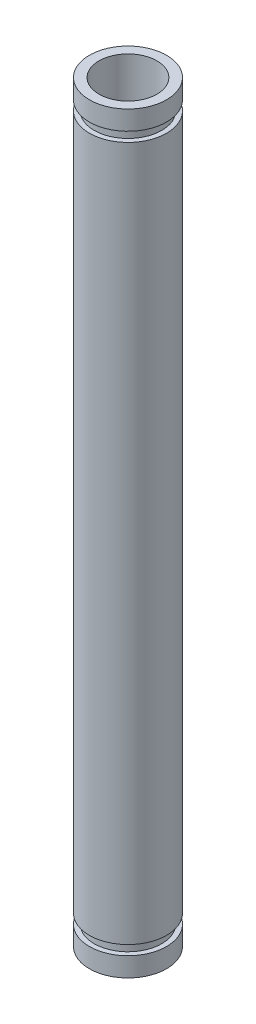
ISO-10303-21;
HEADER;
FILE_DESCRIPTION(('STEP AP214'),'2;1');
FILE_NAME('part.step','',(''),(''),'','','');
FILE_SCHEMA(('AUTOMOTIVE_DESIGN { 1 0 10303 214 1 1 1 1 }'));
ENDSEC;
DATA;
#1=APPLICATION_CONTEXT('core data for automotive mechanical design processes');
#2=APPLICATION_PROTOCOL_DEFINITION('international standard','automotive_design',2000,#1);
#3=PRODUCT_CONTEXT('',#1,'mechanical');
#4=PRODUCT('Part','Part','',(#3));
#5=PRODUCT_RELATED_PRODUCT_CATEGORY('part','',(#4));
#6=PRODUCT_DEFINITION_FORMATION('','',#4);
#7=PRODUCT_DEFINITION_CONTEXT('part definition',#1,'design');
#8=PRODUCT_DEFINITION('design','',#6,#7);
#9=PRODUCT_DEFINITION_SHAPE('','',#8);
#10=(LENGTH_UNIT() NAMED_UNIT(*) SI_UNIT(.MILLI.,.METRE.));
#11=(NAMED_UNIT(*) PLANE_ANGLE_UNIT() SI_UNIT($,.RADIAN.));
#12=(NAMED_UNIT(*) SI_UNIT($,.STERADIAN.) SOLID_ANGLE_UNIT());
#13=UNCERTAINTY_MEASURE_WITH_UNIT(LENGTH_MEASURE(1.E-05),#10,'distance_accuracy_value','');
#14=(GEOMETRIC_REPRESENTATION_CONTEXT(3) GLOBAL_UNCERTAINTY_ASSIGNED_CONTEXT((#13)) GLOBAL_UNIT_ASSIGNED_CONTEXT((#10,
#11,#12)) REPRESENTATION_CONTEXT('',''));
#15=CARTESIAN_POINT('',(0.,0.,0.));
#16=DIRECTION('',(0.,0.,1.));
#17=DIRECTION('',(1.,0.,0.));
#18=AXIS2_PLACEMENT_3D('',#15,#16,#17);
#19=CARTESIAN_POINT('',(0.,43.9529442426575,0.));
#20=DIRECTION('',(0.,1.,0.));
#21=DIRECTION('',(0.,0.,1.));
#22=AXIS2_PLACEMENT_3D('',#19,#20,#21);
#23=CYLINDRICAL_SURFACE('',#22,3.);
#24=CARTESIAN_POINT('',(0.,39.,0.));
#25=DIRECTION('',(0.,1.,0.));
#26=DIRECTION('',(0.,0.,1.));
#27=AXIS2_PLACEMENT_3D('',#24,#25,#26);
#28=CIRCLE('',#27,3.);
#29=CARTESIAN_POINT('',(0.,39.,3.));
#30=VERTEX_POINT('',#29);
#31=EDGE_CURVE('E93',#30,#30,#28,.T.);
#32=ORIENTED_EDGE('',*,*,#31,.T.);
#33=EDGE_LOOP('',(#32));
#34=FACE_BOUND('',#33,.T.);
#35=CARTESIAN_POINT('',(0.,-39.,0.));
#36=DIRECTION('',(0.,1.,0.));
#37=DIRECTION('',(0.,0.,1.));
#38=AXIS2_PLACEMENT_3D('',#35,#36,#37);
#39=CIRCLE('',#38,3.);
#40=CARTESIAN_POINT('',(0.,-39.,3.));
#41=VERTEX_POINT('',#40);
#42=EDGE_CURVE('E10',#41,#41,#39,.T.);
#43=ORIENTED_EDGE('',*,*,#42,.F.);
#44=EDGE_LOOP('',(#43));
#45=FACE_BOUND('',#44,.T.);
#46=ADVANCED_FACE('F45',(#34,#45),#23,.F.);
#47=CARTESIAN_POINT('',(-3.,-39.,0.));
#48=DIRECTION('',(0.,-1.,0.));
#49=DIRECTION('',(0.,0.,-1.));
#50=AXIS2_PLACEMENT_3D('',#47,#48,#49);
#51=PLANE('',#50);
#52=ORIENTED_EDGE('',*,*,#42,.T.);
#53=EDGE_LOOP('',(#52));
#54=FACE_BOUND('',#53,.T.);
#55=CARTESIAN_POINT('',(0.,-39.,0.));
#56=DIRECTION('',(0.,1.,0.));
#57=DIRECTION('',(0.,0.,1.));
#58=AXIS2_PLACEMENT_3D('',#55,#56,#57);
#59=CIRCLE('',#58,4.);
#60=CARTESIAN_POINT('',(0.,-39.,4.));
#61=VERTEX_POINT('',#60);
#62=EDGE_CURVE('E47',#61,#61,#59,.T.);
#63=ORIENTED_EDGE('',*,*,#62,.F.);
#64=EDGE_LOOP('',(#63));
#65=FACE_BOUND('',#64,.T.);
#66=ADVANCED_FACE('F115',(#54,#65),#51,.T.);
#67=CARTESIAN_POINT('',(0.,43.9529442426575,0.));
#68=DIRECTION('',(0.,1.,0.));
#69=DIRECTION('',(0.,0.,1.));
#70=AXIS2_PLACEMENT_3D('',#67,#68,#69);
#71=CYLINDRICAL_SURFACE('',#70,4.);
#72=ORIENTED_EDGE('',*,*,#62,.T.);
#73=EDGE_LOOP('',(#72));
#74=FACE_BOUND('',#73,.T.);
#75=CARTESIAN_POINT('',(0.,-37.,0.));
#76=DIRECTION('',(0.,1.,0.));
#77=DIRECTION('',(0.,0.,1.));
#78=AXIS2_PLACEMENT_3D('',#75,#76,#77);
#79=CIRCLE('',#78,4.);
#80=CARTESIAN_POINT('',(0.,-37.,4.));
#81=VERTEX_POINT('',#80);
#82=EDGE_CURVE('E53',#81,#81,#79,.T.);
#83=ORIENTED_EDGE('',*,*,#82,.F.);
#84=EDGE_LOOP('',(#83));
#85=FACE_BOUND('',#84,.T.);
#86=ADVANCED_FACE('F117',(#74,#85),#71,.T.);
#87=CARTESIAN_POINT('',(-4.,-37.,0.));
#88=DIRECTION('',(0.,1.,0.));
#89=DIRECTION('',(0.,0.,1.));
#90=AXIS2_PLACEMENT_3D('',#87,#88,#89);
#91=PLANE('',#90);
#92=ORIENTED_EDGE('',*,*,#82,.T.);
#93=EDGE_LOOP('',(#92));
#94=FACE_BOUND('',#93,.T.);
#95=CARTESIAN_POINT('',(0.,-37.,0.));
#96=DIRECTION('',(0.,1.,0.));
#97=DIRECTION('',(0.,0.,1.));
#98=AXIS2_PLACEMENT_3D('',#95,#96,#97);
#99=CIRCLE('',#98,3.5);
#100=CARTESIAN_POINT('',(0.,-37.,3.5));
#101=VERTEX_POINT('',#100);
#102=EDGE_CURVE('E56',#101,#101,#99,.T.);
#103=ORIENTED_EDGE('',*,*,#102,.F.);
#104=EDGE_LOOP('',(#103));
#105=FACE_BOUND('',#104,.T.);
#106=ADVANCED_FACE('F118',(#94,#105),#91,.T.);
#107=CARTESIAN_POINT('',(0.,43.9529442426575,0.));
#108=DIRECTION('',(0.,1.,0.));
#109=DIRECTION('',(0.,0.,1.));
#110=AXIS2_PLACEMENT_3D('',#107,#108,#109);
#111=CYLINDRICAL_SURFACE('',#110,3.5);
#112=ORIENTED_EDGE('',*,*,#102,.T.);
#113=EDGE_LOOP('',(#112));
#114=FACE_BOUND('',#113,.T.);
#115=CARTESIAN_POINT('',(0.,-36.,0.));
#116=DIRECTION('',(0.,1.,0.));
#117=DIRECTION('',(0.,0.,1.));
#118=AXIS2_PLACEMENT_3D('',#115,#116,#117);
#119=CIRCLE('',#118,3.5);
#120=CARTESIAN_POINT('',(0.,-36.,3.5));
#121=VERTEX_POINT('',#120);
#122=EDGE_CURVE('E64',#121,#121,#119,.T.);
#123=ORIENTED_EDGE('',*,*,#122,.F.);
#124=EDGE_LOOP('',(#123));
#125=FACE_BOUND('',#124,.T.);
#126=ADVANCED_FACE('F128',(#114,#125),#111,.T.);
#127=CARTESIAN_POINT('',(-3.5,-36.,0.));
#128=DIRECTION('',(0.,-1.,0.));
#129=DIRECTION('',(0.,0.,-1.));
#130=AXIS2_PLACEMENT_3D('',#127,#128,#129);
#131=PLANE('',#130);
#132=ORIENTED_EDGE('',*,*,#122,.T.);
#133=EDGE_LOOP('',(#132));
#134=FACE_BOUND('',#133,.T.);
#135=CARTESIAN_POINT('',(0.,-36.,0.));
#136=DIRECTION('',(0.,1.,0.));
#137=DIRECTION('',(0.,0.,1.));
#138=AXIS2_PLACEMENT_3D('',#135,#136,#137);
#139=CIRCLE('',#138,4.);
#140=CARTESIAN_POINT('',(0.,-36.,4.));
#141=VERTEX_POINT('',#140);
#142=EDGE_CURVE('E69',#141,#141,#139,.T.);
#143=ORIENTED_EDGE('',*,*,#142,.F.);
#144=EDGE_LOOP('',(#143));
#145=FACE_BOUND('',#144,.T.);
#146=ADVANCED_FACE('F127',(#134,#145),#131,.T.);
#147=CARTESIAN_POINT('',(0.,43.9529442426575,0.));
#148=DIRECTION('',(0.,1.,0.));
#149=DIRECTION('',(0.,0.,1.));
#150=AXIS2_PLACEMENT_3D('',#147,#148,#149);
#151=CYLINDRICAL_SURFACE('',#150,4.);
#152=ORIENTED_EDGE('',*,*,#142,.T.);
#153=EDGE_LOOP('',(#152));
#154=FACE_BOUND('',#153,.T.);
#155=CARTESIAN_POINT('',(0.,36.,0.));
#156=DIRECTION('',(0.,1.,0.));
#157=DIRECTION('',(0.,0.,1.));
#158=AXIS2_PLACEMENT_3D('',#155,#156,#157);
#159=CIRCLE('',#158,4.);
#160=CARTESIAN_POINT('',(0.,36.,4.));
#161=VERTEX_POINT('',#160);
#162=EDGE_CURVE('E75',#161,#161,#159,.T.);
#163=ORIENTED_EDGE('',*,*,#162,.F.);
#164=EDGE_LOOP('',(#163));
#165=FACE_BOUND('',#164,.T.);
#166=ADVANCED_FACE('F132',(#154,#165),#151,.T.);
#167=CARTESIAN_POINT('',(-3.5,36.,0.));
#168=DIRECTION('',(0.,1.,0.));
#169=DIRECTION('',(0.,0.,1.));
#170=AXIS2_PLACEMENT_3D('',#167,#168,#169);
#171=PLANE('',#170);
#172=ORIENTED_EDGE('',*,*,#162,.T.);
#173=EDGE_LOOP('',(#172));
#174=FACE_BOUND('',#173,.T.);
#175=CARTESIAN_POINT('',(0.,36.,0.));
#176=DIRECTION('',(0.,1.,0.));
#177=DIRECTION('',(0.,0.,1.));
#178=AXIS2_PLACEMENT_3D('',#175,#176,#177);
#179=CIRCLE('',#178,3.5);
#180=CARTESIAN_POINT('',(0.,36.,3.5));
#181=VERTEX_POINT('',#180);
#182=EDGE_CURVE('E77',#181,#181,#179,.T.);
#183=ORIENTED_EDGE('',*,*,#182,.F.);
#184=EDGE_LOOP('',(#183));
#185=FACE_BOUND('',#184,.T.);
#186=ADVANCED_FACE('F138',(#174,#185),#171,.T.);
#187=CARTESIAN_POINT('',(0.,43.9529442426575,0.));
#188=DIRECTION('',(0.,1.,0.));
#189=DIRECTION('',(0.,0.,1.));
#190=AXIS2_PLACEMENT_3D('',#187,#188,#189);
#191=CYLINDRICAL_SURFACE('',#190,3.5);
#192=ORIENTED_EDGE('',*,*,#182,.T.);
#193=EDGE_LOOP('',(#192));
#194=FACE_BOUND('',#193,.T.);
#195=CARTESIAN_POINT('',(0.,37.,0.));
#196=DIRECTION('',(0.,1.,0.));
#197=DIRECTION('',(0.,0.,1.));
#198=AXIS2_PLACEMENT_3D('',#195,#196,#197);
#199=CIRCLE('',#198,3.5);
#200=CARTESIAN_POINT('',(0.,37.,3.5));
#201=VERTEX_POINT('',#200);
#202=EDGE_CURVE('E83',#201,#201,#199,.T.);
#203=ORIENTED_EDGE('',*,*,#202,.F.);
#204=EDGE_LOOP('',(#203));
#205=FACE_BOUND('',#204,.T.);
#206=ADVANCED_FACE('F145',(#194,#205),#191,.T.);
#207=CARTESIAN_POINT('',(-4.,37.,0.));
#208=DIRECTION('',(0.,-1.,0.));
#209=DIRECTION('',(0.,0.,-1.));
#210=AXIS2_PLACEMENT_3D('',#207,#208,#209);
#211=PLANE('',#210);
#212=ORIENTED_EDGE('',*,*,#202,.T.);
#213=EDGE_LOOP('',(#212));
#214=FACE_BOUND('',#213,.T.);
#215=CARTESIAN_POINT('',(0.,37.,0.));
#216=DIRECTION('',(0.,1.,0.));
#217=DIRECTION('',(0.,0.,1.));
#218=AXIS2_PLACEMENT_3D('',#215,#216,#217);
#219=CIRCLE('',#218,4.);
#220=CARTESIAN_POINT('',(0.,37.,4.));
#221=VERTEX_POINT('',#220);
#222=EDGE_CURVE('E82',#221,#221,#219,.T.);
#223=ORIENTED_EDGE('',*,*,#222,.F.);
#224=EDGE_LOOP('',(#223));
#225=FACE_BOUND('',#224,.T.);
#226=ADVANCED_FACE('F106',(#214,#225),#211,.T.);
#227=CARTESIAN_POINT('',(0.,43.9529442426575,0.));
#228=DIRECTION('',(0.,1.,0.));
#229=DIRECTION('',(0.,0.,1.));
#230=AXIS2_PLACEMENT_3D('',#227,#228,#229);
#231=CYLINDRICAL_SURFACE('',#230,4.);
#232=ORIENTED_EDGE('',*,*,#222,.T.);
#233=EDGE_LOOP('',(#232));
#234=FACE_BOUND('',#233,.T.);
#235=CARTESIAN_POINT('',(0.,39.,0.));
#236=DIRECTION('',(0.,1.,0.));
#237=DIRECTION('',(0.,0.,1.));
#238=AXIS2_PLACEMENT_3D('',#235,#236,#237);
#239=CIRCLE('',#238,4.);
#240=CARTESIAN_POINT('',(0.,39.,4.));
#241=VERTEX_POINT('',#240);
#242=EDGE_CURVE('E87',#241,#241,#239,.T.);
#243=ORIENTED_EDGE('',*,*,#242,.F.);
#244=EDGE_LOOP('',(#243));
#245=FACE_BOUND('',#244,.T.);
#246=ADVANCED_FACE('F105',(#234,#245),#231,.T.);
#247=CARTESIAN_POINT('',(-3.,39.,0.));
#248=DIRECTION('',(0.,1.,0.));
#249=DIRECTION('',(0.,0.,1.));
#250=AXIS2_PLACEMENT_3D('',#247,#248,#249);
#251=PLANE('',#250);
#252=ORIENTED_EDGE('',*,*,#242,.T.);
#253=EDGE_LOOP('',(#252));
#254=FACE_BOUND('',#253,.T.);
#255=ORIENTED_EDGE('',*,*,#31,.F.);
#256=EDGE_LOOP('',(#255));
#257=FACE_BOUND('',#256,.T.);
#258=ADVANCED_FACE('F99',(#254,#257),#251,.T.);
#259=CLOSED_SHELL('',(#46,#66,#86,#106,#126,#146,#166,#186,#206,#226,#246,#258));
#260=MANIFOLD_SOLID_BREP('B2',#259);
#261=ADVANCED_BREP_SHAPE_REPRESENTATION('',(#18,#260),#14);
#262=SHAPE_DEFINITION_REPRESENTATION(#9,#261);
ENDSEC;
END-ISO-10303-21;
